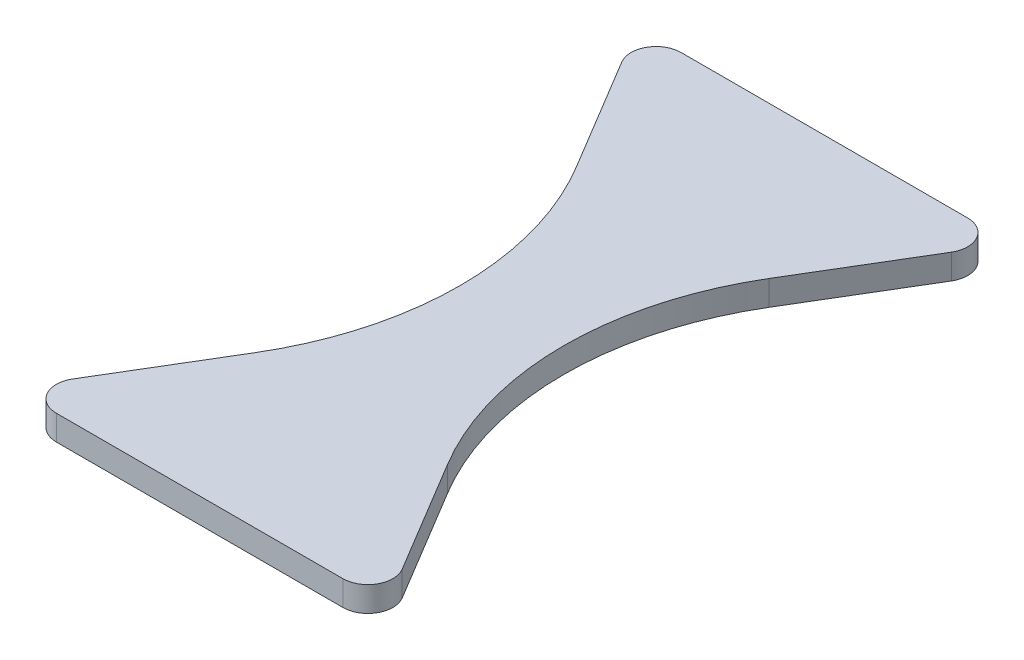
ISO-10303-21;
HEADER;
FILE_DESCRIPTION(('STEP AP214'),'2;1');
FILE_NAME('part.step','',(''),(''),'','','');
FILE_SCHEMA(('AUTOMOTIVE_DESIGN { 1 0 10303 214 1 1 1 1 }'));
ENDSEC;
DATA;
#1=APPLICATION_CONTEXT('core data for automotive mechanical design processes');
#2=APPLICATION_PROTOCOL_DEFINITION('international standard','automotive_design',2000,#1);
#3=PRODUCT_CONTEXT('',#1,'mechanical');
#4=PRODUCT('Part','Part','',(#3));
#5=PRODUCT_RELATED_PRODUCT_CATEGORY('part','',(#4));
#6=PRODUCT_DEFINITION_FORMATION('','',#4);
#7=PRODUCT_DEFINITION_CONTEXT('part definition',#1,'design');
#8=PRODUCT_DEFINITION('design','',#6,#7);
#9=PRODUCT_DEFINITION_SHAPE('','',#8);
#10=(LENGTH_UNIT() NAMED_UNIT(*) SI_UNIT(.MILLI.,.METRE.));
#11=(NAMED_UNIT(*) PLANE_ANGLE_UNIT() SI_UNIT($,.RADIAN.));
#12=(NAMED_UNIT(*) SI_UNIT($,.STERADIAN.) SOLID_ANGLE_UNIT());
#13=UNCERTAINTY_MEASURE_WITH_UNIT(LENGTH_MEASURE(1.E-05),#10,'distance_accuracy_value','');
#14=(GEOMETRIC_REPRESENTATION_CONTEXT(3) GLOBAL_UNCERTAINTY_ASSIGNED_CONTEXT((#13)) GLOBAL_UNIT_ASSIGNED_CONTEXT((#10,
#11,#12)) REPRESENTATION_CONTEXT('',''));
#15=CARTESIAN_POINT('',(0.,0.,0.));
#16=DIRECTION('',(0.,0.,1.));
#17=DIRECTION('',(1.,0.,0.));
#18=AXIS2_PLACEMENT_3D('',#15,#16,#17);
#19=CARTESIAN_POINT('',(-450.,-200.,-925.));
#20=DIRECTION('',(0.,1.,0.));
#21=DIRECTION('',(1.,0.,0.));
#22=AXIS2_PLACEMENT_3D('',#19,#20,#21);
#23=PLANE('',#22);
#24=CARTESIAN_POINT('',(-507.33809621031,-200.,-810.));
#25=DIRECTION('',(0.,1.,0.));
#26=DIRECTION('',(-0.857492925712531,0.,-0.514495755427549));
#27=AXIS2_PLACEMENT_3D('',#24,#25,#26);
#28=CIRCLE('',#27,9.99999999999939);
#29=CARTESIAN_POINT('',(-515.913025467435,-200.,-815.144957554275));
#30=VERTEX_POINT('',#29);
#31=CARTESIAN_POINT('',(-507.338096210309,-200.,-800.));
#32=VERTEX_POINT('',#31);
#33=EDGE_CURVE('E26',#30,#32,#28,.T.);
#34=ORIENTED_EDGE('',*,*,#33,.F.);
#35=DIRECTION('',(0.514495755427523,0.,-0.857492925712547));
#36=VECTOR('',#35,1.);
#37=CARTESIAN_POINT('',(-515.913025467435,-200.,-815.144957554275));
#38=LINE('',#37,#36);
#39=CARTESIAN_POINT('',(-488.587181657065,-200.,-860.688030571559));
#40=VERTEX_POINT('',#39);
#41=EDGE_CURVE('E136',#30,#40,#38,.T.);
#42=ORIENTED_EDGE('',*,*,#41,.T.);
#43=CARTESIAN_POINT('',(-595.773797371137,-200.,-925.));
#44=DIRECTION('',(0.,1.,0.));
#45=DIRECTION('',(0.857492925712551,0.,0.514495755427515));
#46=AXIS2_PLACEMENT_3D('',#43,#44,#45);
#47=CIRCLE('',#46,125.000000000003);
#48=CARTESIAN_POINT('',(-488.587181657065,-200.,-989.311969428441));
#49=VERTEX_POINT('',#48);
#50=EDGE_CURVE('E173',#40,#49,#47,.T.);
#51=ORIENTED_EDGE('',*,*,#50,.T.);
#52=DIRECTION('',(-0.514495755427524,0.,-0.857492925712546));
#53=VECTOR('',#52,1.);
#54=CARTESIAN_POINT('',(-488.587181657065,-200.,-989.311969428441));
#55=LINE('',#54,#53);
#56=CARTESIAN_POINT('',(-515.913025467435,-200.,-1034.85504244572));
#57=VERTEX_POINT('',#56);
#58=EDGE_CURVE('E170',#49,#57,#55,.T.);
#59=ORIENTED_EDGE('',*,*,#58,.T.);
#60=CARTESIAN_POINT('',(-507.33809621031,-200.,-1040.));
#61=DIRECTION('',(0.,1.,0.));
#62=DIRECTION('',(0.,0.,-1.));
#63=AXIS2_PLACEMENT_3D('',#60,#61,#62);
#64=CIRCLE('',#63,9.99999999999972);
#65=CARTESIAN_POINT('',(-507.338096210309,-200.,-1050.));
#66=VERTEX_POINT('',#65);
#67=EDGE_CURVE('E183',#66,#57,#64,.T.);
#68=ORIENTED_EDGE('',*,*,#67,.F.);
#69=DIRECTION('',(-1.,0.,0.));
#70=VECTOR('',#69,1.);
#71=CARTESIAN_POINT('',(-392.661903789692,-200.,-1050.));
#72=LINE('',#71,#70);
#73=CARTESIAN_POINT('',(-392.661903789692,-200.,-1050.));
#74=VERTEX_POINT('',#73);
#75=EDGE_CURVE('E206',#74,#66,#72,.T.);
#76=ORIENTED_EDGE('',*,*,#75,.F.);
#77=CARTESIAN_POINT('',(-392.661903789691,-200.,-1040.));
#78=DIRECTION('',(0.,1.,0.));
#79=DIRECTION('',(0.857492925712525,0.,0.514495755427558));
#80=AXIS2_PLACEMENT_3D('',#77,#78,#79);
#81=CIRCLE('',#80,9.99999999999978);
#82=CARTESIAN_POINT('',(-384.086974532566,-200.,-1034.85504244572));
#83=VERTEX_POINT('',#82);
#84=EDGE_CURVE('E197',#83,#74,#81,.T.);
#85=ORIENTED_EDGE('',*,*,#84,.F.);
#86=DIRECTION('',(0.514495755427516,0.,-0.85749292571255));
#87=VECTOR('',#86,1.);
#88=CARTESIAN_POINT('',(-411.412818342936,-200.,-989.311969428441));
#89=LINE('',#88,#87);
#90=CARTESIAN_POINT('',(-411.412818342936,-200.,-989.311969428441));
#91=VERTEX_POINT('',#90);
#92=EDGE_CURVE('E218',#91,#83,#89,.T.);
#93=ORIENTED_EDGE('',*,*,#92,.F.);
#94=CARTESIAN_POINT('',(-304.226202628869,-200.,-925.));
#95=DIRECTION('',(0.,1.,0.));
#96=DIRECTION('',(-0.857492925712541,0.,-0.514495755427532));
#97=AXIS2_PLACEMENT_3D('',#94,#95,#96);
#98=CIRCLE('',#97,124.999999999998);
#99=CARTESIAN_POINT('',(-411.412818342936,-200.,-860.688030571559));
#100=VERTEX_POINT('',#99);
#101=EDGE_CURVE('E228',#91,#100,#98,.T.);
#102=ORIENTED_EDGE('',*,*,#101,.T.);
#103=DIRECTION('',(-0.514495755427524,0.,-0.857492925712546));
#104=VECTOR('',#103,1.);
#105=CARTESIAN_POINT('',(-384.086974532565,-200.,-815.144957554275));
#106=LINE('',#105,#104);
#107=CARTESIAN_POINT('',(-384.086974532565,-200.,-815.144957554276));
#108=VERTEX_POINT('',#107);
#109=EDGE_CURVE('E239',#108,#100,#106,.T.);
#110=ORIENTED_EDGE('',*,*,#109,.F.);
#111=CARTESIAN_POINT('',(-392.66190378969,-200.,-810.));
#112=DIRECTION('',(0.,1.,0.));
#113=DIRECTION('',(0.,0.,1.));
#114=AXIS2_PLACEMENT_3D('',#111,#112,#113);
#115=CIRCLE('',#114,10.);
#116=CARTESIAN_POINT('',(-392.66190378969,-200.,-800.));
#117=VERTEX_POINT('',#116);
#118=EDGE_CURVE('E164',#117,#108,#115,.T.);
#119=ORIENTED_EDGE('',*,*,#118,.F.);
#120=DIRECTION('',(1.,0.,0.));
#121=VECTOR('',#120,1.);
#122=CARTESIAN_POINT('',(-507.338096210309,-200.,-800.));
#123=LINE('',#122,#121);
#124=EDGE_CURVE('E138',#32,#117,#123,.T.);
#125=ORIENTED_EDGE('',*,*,#124,.F.);
#126=EDGE_LOOP('',(#34,#42,#51,#59,#68,#76,#85,#93,#102,#110,#119,#125));
#127=FACE_BOUND('',#126,.T.);
#128=ADVANCED_FACE('F17',(#127),#23,.F.);
#129=CARTESIAN_POINT('',(-450.,-190.,-925.));
#130=DIRECTION('',(0.,1.,0.));
#131=DIRECTION('',(1.,0.,0.));
#132=AXIS2_PLACEMENT_3D('',#129,#130,#131);
#133=PLANE('',#132);
#134=CARTESIAN_POINT('',(-507.33809621031,-190.,-810.));
#135=DIRECTION('',(0.,1.,0.));
#136=DIRECTION('',(-0.857492925712531,0.,-0.514495755427549));
#137=AXIS2_PLACEMENT_3D('',#134,#135,#136);
#138=CIRCLE('',#137,9.99999999999939);
#139=CARTESIAN_POINT('',(-515.913025467435,-190.,-815.144957554275));
#140=VERTEX_POINT('',#139);
#141=CARTESIAN_POINT('',(-507.338096210309,-190.,-800.));
#142=VERTEX_POINT('',#141);
#143=EDGE_CURVE('E11',#140,#142,#138,.T.);
#144=ORIENTED_EDGE('',*,*,#143,.T.);
#145=DIRECTION('',(1.,0.,0.));
#146=VECTOR('',#145,1.);
#147=CARTESIAN_POINT('',(-507.338096210309,-190.,-800.));
#148=LINE('',#147,#146);
#149=CARTESIAN_POINT('',(-392.66190378969,-190.,-800.));
#150=VERTEX_POINT('',#149);
#151=EDGE_CURVE('E182',#142,#150,#148,.T.);
#152=ORIENTED_EDGE('',*,*,#151,.T.);
#153=CARTESIAN_POINT('',(-392.66190378969,-190.,-810.));
#154=DIRECTION('',(0.,1.,0.));
#155=DIRECTION('',(0.,0.,1.));
#156=AXIS2_PLACEMENT_3D('',#153,#154,#155);
#157=CIRCLE('',#156,10.);
#158=CARTESIAN_POINT('',(-384.086974532565,-190.,-815.144957554276));
#159=VERTEX_POINT('',#158);
#160=EDGE_CURVE('E161',#150,#159,#157,.T.);
#161=ORIENTED_EDGE('',*,*,#160,.T.);
#162=DIRECTION('',(-0.514495755427524,0.,-0.857492925712546));
#163=VECTOR('',#162,1.);
#164=CARTESIAN_POINT('',(-384.086974532565,-190.,-815.144957554275));
#165=LINE('',#164,#163);
#166=CARTESIAN_POINT('',(-411.412818342936,-190.,-860.688030571559));
#167=VERTEX_POINT('',#166);
#168=EDGE_CURVE('E242',#159,#167,#165,.T.);
#169=ORIENTED_EDGE('',*,*,#168,.T.);
#170=CARTESIAN_POINT('',(-304.226202628869,-190.,-925.));
#171=DIRECTION('',(0.,-1.,0.));
#172=DIRECTION('',(-0.857492925712541,0.,-0.514495755427532));
#173=AXIS2_PLACEMENT_3D('',#170,#171,#172);
#174=CIRCLE('',#173,124.999999999998);
#175=CARTESIAN_POINT('',(-411.412818342936,-190.,-989.311969428441));
#176=VERTEX_POINT('',#175);
#177=EDGE_CURVE('E232',#167,#176,#174,.T.);
#178=ORIENTED_EDGE('',*,*,#177,.T.);
#179=DIRECTION('',(0.514495755427516,0.,-0.85749292571255));
#180=VECTOR('',#179,1.);
#181=CARTESIAN_POINT('',(-411.412818342936,-190.,-989.311969428441));
#182=LINE('',#181,#180);
#183=CARTESIAN_POINT('',(-384.086974532566,-190.,-1034.85504244572));
#184=VERTEX_POINT('',#183);
#185=EDGE_CURVE('E221',#176,#184,#182,.T.);
#186=ORIENTED_EDGE('',*,*,#185,.T.);
#187=CARTESIAN_POINT('',(-392.661903789691,-190.,-1040.));
#188=DIRECTION('',(0.,1.,0.));
#189=DIRECTION('',(0.857492925712525,0.,0.514495755427558));
#190=AXIS2_PLACEMENT_3D('',#187,#188,#189);
#191=CIRCLE('',#190,9.99999999999978);
#192=CARTESIAN_POINT('',(-392.661903789692,-190.,-1050.));
#193=VERTEX_POINT('',#192);
#194=EDGE_CURVE('E211',#184,#193,#191,.T.);
#195=ORIENTED_EDGE('',*,*,#194,.T.);
#196=DIRECTION('',(-1.,0.,0.));
#197=VECTOR('',#196,1.);
#198=CARTESIAN_POINT('',(-392.661903789692,-190.,-1050.));
#199=LINE('',#198,#197);
#200=CARTESIAN_POINT('',(-507.338096210309,-190.,-1050.));
#201=VERTEX_POINT('',#200);
#202=EDGE_CURVE('E198',#193,#201,#199,.T.);
#203=ORIENTED_EDGE('',*,*,#202,.T.);
#204=CARTESIAN_POINT('',(-507.33809621031,-190.,-1040.));
#205=DIRECTION('',(0.,1.,0.));
#206=DIRECTION('',(0.,0.,-1.));
#207=AXIS2_PLACEMENT_3D('',#204,#205,#206);
#208=CIRCLE('',#207,9.99999999999972);
#209=CARTESIAN_POINT('',(-515.913025467435,-190.,-1034.85504244572));
#210=VERTEX_POINT('',#209);
#211=EDGE_CURVE('E186',#201,#210,#208,.T.);
#212=ORIENTED_EDGE('',*,*,#211,.T.);
#213=DIRECTION('',(0.514495755427524,0.,0.857492925712546));
#214=VECTOR('',#213,1.);
#215=CARTESIAN_POINT('',(-488.587181657065,-190.,-989.311969428441));
#216=LINE('',#215,#214);
#217=CARTESIAN_POINT('',(-488.587181657065,-190.,-989.311969428441));
#218=VERTEX_POINT('',#217);
#219=EDGE_CURVE('E166',#210,#218,#216,.T.);
#220=ORIENTED_EDGE('',*,*,#219,.T.);
#221=CARTESIAN_POINT('',(-595.773797371137,-190.,-925.));
#222=DIRECTION('',(0.,-1.,0.));
#223=DIRECTION('',(0.857492925712551,0.,0.514495755427515));
#224=AXIS2_PLACEMENT_3D('',#221,#222,#223);
#225=CIRCLE('',#224,125.000000000003);
#226=CARTESIAN_POINT('',(-488.587181657065,-190.,-860.688030571559));
#227=VERTEX_POINT('',#226);
#228=EDGE_CURVE('E176',#218,#227,#225,.T.);
#229=ORIENTED_EDGE('',*,*,#228,.T.);
#230=DIRECTION('',(-0.514495755427523,0.,0.857492925712547));
#231=VECTOR('',#230,1.);
#232=CARTESIAN_POINT('',(-515.913025467435,-190.,-815.144957554275));
#233=LINE('',#232,#231);
#234=EDGE_CURVE('E146',#227,#140,#233,.T.);
#235=ORIENTED_EDGE('',*,*,#234,.T.);
#236=EDGE_LOOP('',(#144,#152,#161,#169,#178,#186,#195,#203,#212,#220,#229,#235));
#237=FACE_BOUND('',#236,.T.);
#238=ADVANCED_FACE('F263',(#237),#133,.T.);
#239=CARTESIAN_POINT('',(-507.33809621031,-200.,-810.));
#240=DIRECTION('',(0.,1.,0.));
#241=DIRECTION('',(-0.857492925712531,0.,-0.514495755427549));
#242=AXIS2_PLACEMENT_3D('',#239,#240,#241);
#243=CYLINDRICAL_SURFACE('',#242,9.99999999999939);
#244=ORIENTED_EDGE('',*,*,#33,.T.);
#245=DIRECTION('',(0.,1.,0.));
#246=VECTOR('',#245,1.);
#247=CARTESIAN_POINT('',(-507.338096210309,-200.,-800.));
#248=LINE('',#247,#246);
#249=EDGE_CURVE('E140',#32,#142,#248,.T.);
#250=ORIENTED_EDGE('',*,*,#249,.T.);
#251=ORIENTED_EDGE('',*,*,#143,.F.);
#252=DIRECTION('',(0.,1.,0.));
#253=VECTOR('',#252,1.);
#254=CARTESIAN_POINT('',(-515.913025467435,-200.,-815.144957554275));
#255=LINE('',#254,#253);
#256=EDGE_CURVE('E142',#30,#140,#255,.T.);
#257=ORIENTED_EDGE('',*,*,#256,.F.);
#258=EDGE_LOOP('',(#244,#250,#251,#257));
#259=FACE_BOUND('',#258,.T.);
#260=ADVANCED_FACE('F19',(#259),#243,.T.);
#261=CARTESIAN_POINT('',(-507.338096210309,-200.,-800.));
#262=DIRECTION('',(0.,0.,1.));
#263=DIRECTION('',(1.,0.,0.));
#264=AXIS2_PLACEMENT_3D('',#261,#262,#263);
#265=PLANE('',#264);
#266=ORIENTED_EDGE('',*,*,#124,.T.);
#267=DIRECTION('',(0.,1.,0.));
#268=VECTOR('',#267,1.);
#269=CARTESIAN_POINT('',(-392.66190378969,-200.,-800.));
#270=LINE('',#269,#268);
#271=EDGE_CURVE('E163',#117,#150,#270,.T.);
#272=ORIENTED_EDGE('',*,*,#271,.T.);
#273=ORIENTED_EDGE('',*,*,#151,.F.);
#274=ORIENTED_EDGE('',*,*,#249,.F.);
#275=EDGE_LOOP('',(#266,#272,#273,#274));
#276=FACE_BOUND('',#275,.T.);
#277=ADVANCED_FACE('F260',(#276),#265,.T.);
#278=CARTESIAN_POINT('',(-392.66190378969,-200.,-810.));
#279=DIRECTION('',(0.,1.,0.));
#280=DIRECTION('',(0.,0.,1.));
#281=AXIS2_PLACEMENT_3D('',#278,#279,#280);
#282=CYLINDRICAL_SURFACE('',#281,10.);
#283=ORIENTED_EDGE('',*,*,#118,.T.);
#284=DIRECTION('',(0.,1.,0.));
#285=VECTOR('',#284,1.);
#286=CARTESIAN_POINT('',(-384.086974532565,-200.,-815.144957554276));
#287=LINE('',#286,#285);
#288=EDGE_CURVE('E245',#108,#159,#287,.T.);
#289=ORIENTED_EDGE('',*,*,#288,.T.);
#290=ORIENTED_EDGE('',*,*,#160,.F.);
#291=ORIENTED_EDGE('',*,*,#271,.F.);
#292=EDGE_LOOP('',(#283,#289,#290,#291));
#293=FACE_BOUND('',#292,.T.);
#294=ADVANCED_FACE('F267',(#293),#282,.T.);
#295=CARTESIAN_POINT('',(-384.086974532565,-200.,-815.144957554275));
#296=DIRECTION('',(0.857492925712546,0.,-0.514495755427524));
#297=DIRECTION('',(0.,-1.,0.));
#298=AXIS2_PLACEMENT_3D('',#295,#296,#297);
#299=PLANE('',#298);
#300=ORIENTED_EDGE('',*,*,#109,.T.);
#301=DIRECTION('',(0.,1.,0.));
#302=VECTOR('',#301,1.);
#303=CARTESIAN_POINT('',(-411.412818342936,-200.,-860.688030571559));
#304=LINE('',#303,#302);
#305=EDGE_CURVE('E235',#100,#167,#304,.T.);
#306=ORIENTED_EDGE('',*,*,#305,.T.);
#307=ORIENTED_EDGE('',*,*,#168,.F.);
#308=ORIENTED_EDGE('',*,*,#288,.F.);
#309=EDGE_LOOP('',(#300,#306,#307,#308));
#310=FACE_BOUND('',#309,.T.);
#311=ADVANCED_FACE('F270',(#310),#299,.T.);
#312=CARTESIAN_POINT('',(-304.226202628869,-200.,-925.));
#313=DIRECTION('',(0.,1.,0.));
#314=DIRECTION('',(-0.857492925712541,0.,-0.514495755427532));
#315=AXIS2_PLACEMENT_3D('',#312,#313,#314);
#316=CYLINDRICAL_SURFACE('',#315,124.999999999998);
#317=ORIENTED_EDGE('',*,*,#101,.F.);
#318=DIRECTION('',(0.,1.,0.));
#319=VECTOR('',#318,1.);
#320=CARTESIAN_POINT('',(-411.412818342936,-200.,-989.311969428441));
#321=LINE('',#320,#319);
#322=EDGE_CURVE('E224',#91,#176,#321,.T.);
#323=ORIENTED_EDGE('',*,*,#322,.T.);
#324=ORIENTED_EDGE('',*,*,#177,.F.);
#325=ORIENTED_EDGE('',*,*,#305,.F.);
#326=EDGE_LOOP('',(#317,#323,#324,#325));
#327=FACE_BOUND('',#326,.T.);
#328=ADVANCED_FACE('F274',(#327),#316,.F.);
#329=CARTESIAN_POINT('',(-411.412818342936,-200.,-989.311969428441));
#330=DIRECTION('',(0.85749292571255,0.,0.514495755427516));
#331=DIRECTION('',(0.,-1.,0.));
#332=AXIS2_PLACEMENT_3D('',#329,#330,#331);
#333=PLANE('',#332);
#334=ORIENTED_EDGE('',*,*,#92,.T.);
#335=DIRECTION('',(0.,1.,0.));
#336=VECTOR('',#335,1.);
#337=CARTESIAN_POINT('',(-384.086974532566,-200.,-1034.85504244572));
#338=LINE('',#337,#336);
#339=EDGE_CURVE('E214',#83,#184,#338,.T.);
#340=ORIENTED_EDGE('',*,*,#339,.T.);
#341=ORIENTED_EDGE('',*,*,#185,.F.);
#342=ORIENTED_EDGE('',*,*,#322,.F.);
#343=EDGE_LOOP('',(#334,#340,#341,#342));
#344=FACE_BOUND('',#343,.T.);
#345=ADVANCED_FACE('F280',(#344),#333,.T.);
#346=CARTESIAN_POINT('',(-392.661903789691,-200.,-1040.));
#347=DIRECTION('',(0.,1.,0.));
#348=DIRECTION('',(0.857492925712525,0.,0.514495755427558));
#349=AXIS2_PLACEMENT_3D('',#346,#347,#348);
#350=CYLINDRICAL_SURFACE('',#349,9.99999999999978);
#351=ORIENTED_EDGE('',*,*,#84,.T.);
#352=DIRECTION('',(0.,1.,0.));
#353=VECTOR('',#352,1.);
#354=CARTESIAN_POINT('',(-392.661903789692,-200.,-1050.));
#355=LINE('',#354,#353);
#356=EDGE_CURVE('E193',#74,#193,#355,.T.);
#357=ORIENTED_EDGE('',*,*,#356,.T.);
#358=ORIENTED_EDGE('',*,*,#194,.F.);
#359=ORIENTED_EDGE('',*,*,#339,.F.);
#360=EDGE_LOOP('',(#351,#357,#358,#359));
#361=FACE_BOUND('',#360,.T.);
#362=ADVANCED_FACE('F284',(#361),#350,.T.);
#363=CARTESIAN_POINT('',(-392.661903789692,-200.,-1050.));
#364=DIRECTION('',(0.,0.,-1.));
#365=DIRECTION('',(-1.,0.,0.));
#366=AXIS2_PLACEMENT_3D('',#363,#364,#365);
#367=PLANE('',#366);
#368=ORIENTED_EDGE('',*,*,#75,.T.);
#369=DIRECTION('',(0.,1.,0.));
#370=VECTOR('',#369,1.);
#371=CARTESIAN_POINT('',(-507.338096210309,-200.,-1050.));
#372=LINE('',#371,#370);
#373=EDGE_CURVE('E158',#66,#201,#372,.T.);
#374=ORIENTED_EDGE('',*,*,#373,.T.);
#375=ORIENTED_EDGE('',*,*,#202,.F.);
#376=ORIENTED_EDGE('',*,*,#356,.F.);
#377=EDGE_LOOP('',(#368,#374,#375,#376));
#378=FACE_BOUND('',#377,.T.);
#379=ADVANCED_FACE('F290',(#378),#367,.T.);
#380=CARTESIAN_POINT('',(-507.33809621031,-200.,-1040.));
#381=DIRECTION('',(0.,1.,0.));
#382=DIRECTION('',(0.,0.,-1.));
#383=AXIS2_PLACEMENT_3D('',#380,#381,#382);
#384=CYLINDRICAL_SURFACE('',#383,9.99999999999972);
#385=ORIENTED_EDGE('',*,*,#67,.T.);
#386=DIRECTION('',(0.,1.,0.));
#387=VECTOR('',#386,1.);
#388=CARTESIAN_POINT('',(-515.913025467435,-200.,-1034.85504244572));
#389=LINE('',#388,#387);
#390=EDGE_CURVE('E169',#57,#210,#389,.T.);
#391=ORIENTED_EDGE('',*,*,#390,.T.);
#392=ORIENTED_EDGE('',*,*,#211,.F.);
#393=ORIENTED_EDGE('',*,*,#373,.F.);
#394=EDGE_LOOP('',(#385,#391,#392,#393));
#395=FACE_BOUND('',#394,.T.);
#396=ADVANCED_FACE('F296',(#395),#384,.T.);
#397=CARTESIAN_POINT('',(-515.913025467435,-200.,-1034.85504244572));
#398=DIRECTION('',(-0.857492925712546,0.,0.514495755427524));
#399=DIRECTION('',(0.,1.,0.));
#400=AXIS2_PLACEMENT_3D('',#397,#398,#399);
#401=PLANE('',#400);
#402=ORIENTED_EDGE('',*,*,#58,.F.);
#403=DIRECTION('',(0.,1.,0.));
#404=VECTOR('',#403,1.);
#405=CARTESIAN_POINT('',(-488.587181657065,-200.,-989.311969428441));
#406=LINE('',#405,#404);
#407=EDGE_CURVE('E179',#49,#218,#406,.T.);
#408=ORIENTED_EDGE('',*,*,#407,.T.);
#409=ORIENTED_EDGE('',*,*,#219,.F.);
#410=ORIENTED_EDGE('',*,*,#390,.F.);
#411=EDGE_LOOP('',(#402,#408,#409,#410));
#412=FACE_BOUND('',#411,.T.);
#413=ADVANCED_FACE('F299',(#412),#401,.T.);
#414=CARTESIAN_POINT('',(-595.773797371137,-200.,-925.));
#415=DIRECTION('',(0.,1.,0.));
#416=DIRECTION('',(0.857492925712551,0.,0.514495755427515));
#417=AXIS2_PLACEMENT_3D('',#414,#415,#416);
#418=CYLINDRICAL_SURFACE('',#417,125.000000000003);
#419=ORIENTED_EDGE('',*,*,#50,.F.);
#420=DIRECTION('',(0.,1.,0.));
#421=VECTOR('',#420,1.);
#422=CARTESIAN_POINT('',(-488.587181657065,-200.,-860.688030571559));
#423=LINE('',#422,#421);
#424=EDGE_CURVE('E151',#40,#227,#423,.T.);
#425=ORIENTED_EDGE('',*,*,#424,.T.);
#426=ORIENTED_EDGE('',*,*,#228,.F.);
#427=ORIENTED_EDGE('',*,*,#407,.F.);
#428=EDGE_LOOP('',(#419,#425,#426,#427));
#429=FACE_BOUND('',#428,.T.);
#430=ADVANCED_FACE('F303',(#429),#418,.F.);
#431=CARTESIAN_POINT('',(-488.587181657065,-200.,-860.688030571559));
#432=DIRECTION('',(-0.857492925712547,0.,-0.514495755427523));
#433=DIRECTION('',(-0.514495755427523,0.,0.857492925712547));
#434=AXIS2_PLACEMENT_3D('',#431,#432,#433);
#435=PLANE('',#434);
#436=ORIENTED_EDGE('',*,*,#41,.F.);
#437=ORIENTED_EDGE('',*,*,#256,.T.);
#438=ORIENTED_EDGE('',*,*,#234,.F.);
#439=ORIENTED_EDGE('',*,*,#424,.F.);
#440=EDGE_LOOP('',(#436,#437,#438,#439));
#441=FACE_BOUND('',#440,.T.);
#442=ADVANCED_FACE('F149',(#441),#435,.T.);
#443=CLOSED_SHELL('',(#128,#238,#260,#277,#294,#311,#328,#345,#362,#379,#396,#413,#430,#442));
#444=MANIFOLD_SOLID_BREP('B1',#443);
#445=ADVANCED_BREP_SHAPE_REPRESENTATION('',(#18,#444),#14);
#446=SHAPE_DEFINITION_REPRESENTATION(#9,#445);
ENDSEC;
END-ISO-10303-21;
